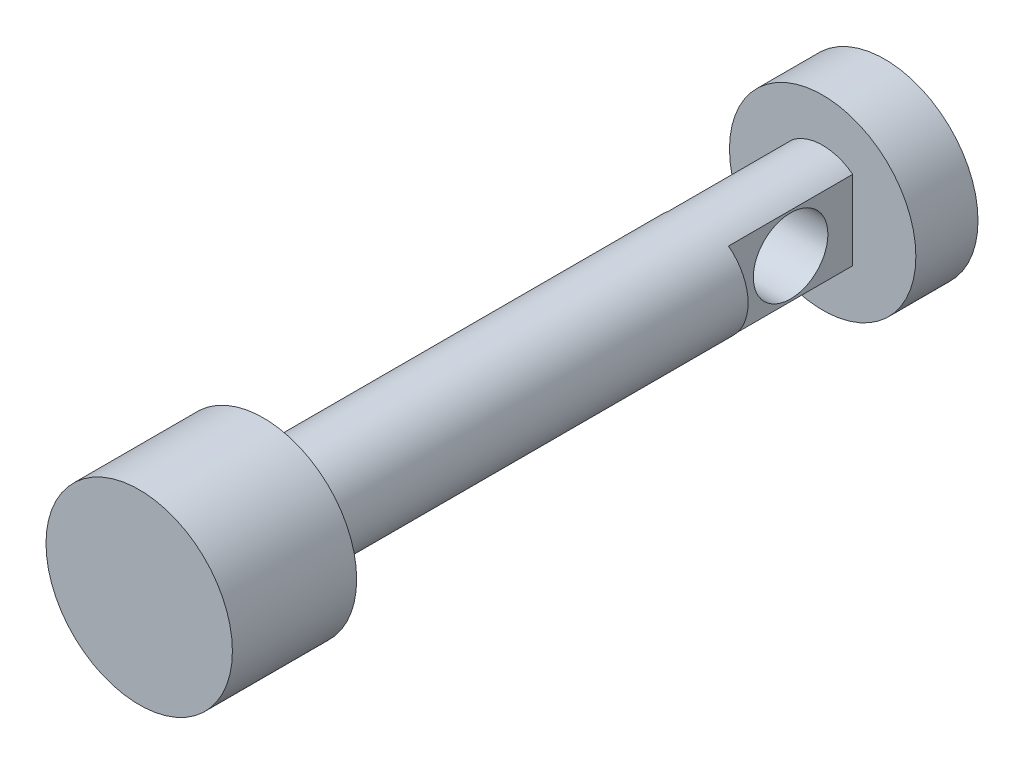
ISO-10303-21;
HEADER;
FILE_DESCRIPTION(('STEP AP214'),'2;1');
FILE_NAME('part.step','',(''),(''),'','','');
FILE_SCHEMA(('AUTOMOTIVE_DESIGN { 1 0 10303 214 1 1 1 1 }'));
ENDSEC;
DATA;
#1=APPLICATION_CONTEXT('core data for automotive mechanical design processes');
#2=APPLICATION_PROTOCOL_DEFINITION('international standard','automotive_design',2000,#1);
#3=PRODUCT_CONTEXT('',#1,'mechanical');
#4=PRODUCT('Part','Part','',(#3));
#5=PRODUCT_RELATED_PRODUCT_CATEGORY('part','',(#4));
#6=PRODUCT_DEFINITION_FORMATION('','',#4);
#7=PRODUCT_DEFINITION_CONTEXT('part definition',#1,'design');
#8=PRODUCT_DEFINITION('design','',#6,#7);
#9=PRODUCT_DEFINITION_SHAPE('','',#8);
#10=(LENGTH_UNIT() NAMED_UNIT(*) SI_UNIT(.MILLI.,.METRE.));
#11=(NAMED_UNIT(*) PLANE_ANGLE_UNIT() SI_UNIT($,.RADIAN.));
#12=(NAMED_UNIT(*) SI_UNIT($,.STERADIAN.) SOLID_ANGLE_UNIT());
#13=UNCERTAINTY_MEASURE_WITH_UNIT(LENGTH_MEASURE(1.E-05),#10,'distance_accuracy_value','');
#14=(GEOMETRIC_REPRESENTATION_CONTEXT(3) GLOBAL_UNCERTAINTY_ASSIGNED_CONTEXT((#13)) GLOBAL_UNIT_ASSIGNED_CONTEXT((#10,
#11,#12)) REPRESENTATION_CONTEXT('',''));
#15=CARTESIAN_POINT('',(0.,0.,0.));
#16=DIRECTION('',(0.,0.,1.));
#17=DIRECTION('',(1.,0.,0.));
#18=AXIS2_PLACEMENT_3D('',#15,#16,#17);
#19=CARTESIAN_POINT('',(0.,0.,60.));
#20=DIRECTION('',(0.,0.,1.));
#21=DIRECTION('',(1.,0.,0.));
#22=AXIS2_PLACEMENT_3D('',#19,#20,#21);
#23=CYLINDRICAL_SURFACE('',#22,8.);
#24=CARTESIAN_POINT('',(0.,0.,40.));
#25=DIRECTION('',(0.,0.,1.));
#26=DIRECTION('',(1.,0.,0.));
#27=AXIS2_PLACEMENT_3D('',#24,#25,#26);
#28=CIRCLE('',#27,8.);
#29=CARTESIAN_POINT('',(8.,0.,40.));
#30=VERTEX_POINT('',#29);
#31=EDGE_CURVE('E107',#30,#30,#28,.T.);
#32=ORIENTED_EDGE('',*,*,#31,.F.);
#33=EDGE_LOOP('',(#32));
#34=FACE_BOUND('',#33,.T.);
#35=DIRECTION('',(0.,0.,-1.));
#36=VECTOR('',#35,1.);
#37=CARTESIAN_POINT('',(-4.83911288800187,-6.3704777259774,-30.));
#38=LINE('',#37,#36);
#39=CARTESIAN_POINT('',(-4.83911288800187,-6.3704777259774,-30.));
#40=VERTEX_POINT('',#39);
#41=CARTESIAN_POINT('',(-4.83911288800187,-6.3704777259774,-50.));
#42=VERTEX_POINT('',#41);
#43=EDGE_CURVE('E78',#40,#42,#38,.T.);
#44=ORIENTED_EDGE('',*,*,#43,.T.);
#45=CARTESIAN_POINT('',(0.,0.,-50.));
#46=DIRECTION('',(0.,0.,-1.));
#47=DIRECTION('',(-1.,0.,0.));
#48=AXIS2_PLACEMENT_3D('',#45,#46,#47);
#49=CIRCLE('',#48,8.);
#50=CARTESIAN_POINT('',(4.83911288800187,-6.3704777259774,-50.));
#51=VERTEX_POINT('',#50);
#52=EDGE_CURVE('E99',#42,#51,#49,.F.);
#53=ORIENTED_EDGE('',*,*,#52,.T.);
#54=DIRECTION('',(0.,0.,-1.));
#55=VECTOR('',#54,1.);
#56=CARTESIAN_POINT('',(4.83911288800187,-6.3704777259774,-30.));
#57=LINE('',#56,#55);
#58=CARTESIAN_POINT('',(4.83911288800187,-6.3704777259774,-30.));
#59=VERTEX_POINT('',#58);
#60=EDGE_CURVE('E122',#59,#51,#57,.T.);
#61=ORIENTED_EDGE('',*,*,#60,.F.);
#62=CARTESIAN_POINT('',(0.,0.,-30.));
#63=DIRECTION('',(0.,0.,-1.));
#64=DIRECTION('',(-1.,0.,0.));
#65=AXIS2_PLACEMENT_3D('',#62,#63,#64);
#66=CIRCLE('',#65,8.);
#67=CARTESIAN_POINT('',(4.83911288800187,6.3704777259774,-30.));
#68=VERTEX_POINT('',#67);
#69=EDGE_CURVE('E196',#68,#59,#66,.T.);
#70=ORIENTED_EDGE('',*,*,#69,.F.);
#71=DIRECTION('',(0.,0.,-1.));
#72=VECTOR('',#71,1.);
#73=CARTESIAN_POINT('',(4.83911288800187,6.3704777259774,-30.));
#74=LINE('',#73,#72);
#75=CARTESIAN_POINT('',(4.83911288800187,6.3704777259774,-50.));
#76=VERTEX_POINT('',#75);
#77=EDGE_CURVE('E102',#68,#76,#74,.T.);
#78=ORIENTED_EDGE('',*,*,#77,.T.);
#79=CARTESIAN_POINT('',(-4.83911288800187,6.3704777259774,-50.));
#80=VERTEX_POINT('',#79);
#81=EDGE_CURVE('E56',#76,#80,#49,.F.);
#82=ORIENTED_EDGE('',*,*,#81,.T.);
#83=DIRECTION('',(0.,0.,-1.));
#84=VECTOR('',#83,1.);
#85=CARTESIAN_POINT('',(-4.83911288800187,6.3704777259774,-30.));
#86=LINE('',#85,#84);
#87=CARTESIAN_POINT('',(-4.83911288800187,6.3704777259774,-30.));
#88=VERTEX_POINT('',#87);
#89=EDGE_CURVE('E89',#88,#80,#86,.T.);
#90=ORIENTED_EDGE('',*,*,#89,.F.);
#91=CARTESIAN_POINT('',(0.,0.,-30.));
#92=DIRECTION('',(0.,0.,-1.));
#93=DIRECTION('',(-1.,0.,0.));
#94=AXIS2_PLACEMENT_3D('',#91,#92,#93);
#95=CIRCLE('',#94,8.);
#96=EDGE_CURVE('E93',#40,#88,#95,.T.);
#97=ORIENTED_EDGE('',*,*,#96,.F.);
#98=EDGE_LOOP('',(#44,#53,#61,#70,#78,#82,#90,#97));
#99=FACE_BOUND('',#98,.T.);
#100=ADVANCED_FACE('F41',(#34,#99),#23,.T.);
#101=CARTESIAN_POINT('',(-4.83911288800187,0.,-30.));
#102=DIRECTION('',(1.,0.,0.));
#103=DIRECTION('',(0.,0.,-1.));
#104=AXIS2_PLACEMENT_3D('',#101,#102,#103);
#105=PLANE('',#104);
#106=CARTESIAN_POINT('',(-4.83911288800187,0.,-40.));
#107=DIRECTION('',(1.,0.,0.));
#108=DIRECTION('',(0.,0.,-1.));
#109=AXIS2_PLACEMENT_3D('',#106,#107,#108);
#110=CIRCLE('',#109,5.99999999999999);
#111=CARTESIAN_POINT('',(-4.83911288800187,0.,-46.));
#112=VERTEX_POINT('',#111);
#113=EDGE_CURVE('E119',#112,#112,#110,.F.);
#114=ORIENTED_EDGE('',*,*,#113,.F.);
#115=EDGE_LOOP('',(#114));
#116=FACE_BOUND('',#115,.T.);
#117=DIRECTION('',(0.,1.,0.));
#118=VECTOR('',#117,1.);
#119=CARTESIAN_POINT('',(-4.83911288800187,0.,-50.));
#120=LINE('',#119,#118);
#121=EDGE_CURVE('E84',#42,#80,#120,.T.);
#122=ORIENTED_EDGE('',*,*,#121,.F.);
#123=ORIENTED_EDGE('',*,*,#43,.F.);
#124=DIRECTION('',(0.,-1.,0.));
#125=VECTOR('',#124,1.);
#126=CARTESIAN_POINT('',(-4.83911288800187,0.,-30.));
#127=LINE('',#126,#125);
#128=EDGE_CURVE('E82',#88,#40,#127,.T.);
#129=ORIENTED_EDGE('',*,*,#128,.F.);
#130=ORIENTED_EDGE('',*,*,#89,.T.);
#131=EDGE_LOOP('',(#122,#123,#129,#130));
#132=FACE_BOUND('',#131,.T.);
#133=ADVANCED_FACE('F80',(#116,#132),#105,.F.);
#134=CARTESIAN_POINT('',(4.83911288800187,0.,-30.));
#135=DIRECTION('',(1.,0.,0.));
#136=DIRECTION('',(0.,0.,-1.));
#137=AXIS2_PLACEMENT_3D('',#134,#135,#136);
#138=PLANE('',#137);
#139=CARTESIAN_POINT('',(4.83911288800187,0.,-40.));
#140=DIRECTION('',(1.,0.,0.));
#141=DIRECTION('',(0.,0.,-1.));
#142=AXIS2_PLACEMENT_3D('',#139,#140,#141);
#143=CIRCLE('',#142,5.99999999999999);
#144=CARTESIAN_POINT('',(4.83911288800187,0.,-46.));
#145=VERTEX_POINT('',#144);
#146=EDGE_CURVE('E112',#145,#145,#143,.F.);
#147=ORIENTED_EDGE('',*,*,#146,.T.);
#148=EDGE_LOOP('',(#147));
#149=FACE_BOUND('',#148,.T.);
#150=ORIENTED_EDGE('',*,*,#60,.T.);
#151=DIRECTION('',(0.,1.,0.));
#152=VECTOR('',#151,1.);
#153=CARTESIAN_POINT('',(4.83911288800187,0.,-50.));
#154=LINE('',#153,#152);
#155=EDGE_CURVE('E11',#51,#76,#154,.T.);
#156=ORIENTED_EDGE('',*,*,#155,.T.);
#157=ORIENTED_EDGE('',*,*,#77,.F.);
#158=DIRECTION('',(0.,-1.,0.));
#159=VECTOR('',#158,1.);
#160=CARTESIAN_POINT('',(4.83911288800187,0.,-30.));
#161=LINE('',#160,#159);
#162=EDGE_CURVE('E64',#68,#59,#161,.T.);
#163=ORIENTED_EDGE('',*,*,#162,.T.);
#164=EDGE_LOOP('',(#150,#156,#157,#163));
#165=FACE_BOUND('',#164,.T.);
#166=ADVANCED_FACE('F127',(#149,#165),#138,.T.);
#167=CARTESIAN_POINT('',(0.,0.,60.));
#168=DIRECTION('',(0.,0.,1.));
#169=DIRECTION('',(1.,0.,0.));
#170=AXIS2_PLACEMENT_3D('',#167,#168,#169);
#171=PLANE('',#170);
#172=CARTESIAN_POINT('',(0.,0.,60.));
#173=DIRECTION('',(0.,0.,1.));
#174=DIRECTION('',(1.,0.,0.));
#175=AXIS2_PLACEMENT_3D('',#172,#173,#174);
#176=CIRCLE('',#175,15.);
#177=CARTESIAN_POINT('',(15.,0.,60.));
#178=VERTEX_POINT('',#177);
#179=EDGE_CURVE('E49',#178,#178,#176,.T.);
#180=ORIENTED_EDGE('',*,*,#179,.T.);
#181=EDGE_LOOP('',(#180));
#182=FACE_BOUND('',#181,.T.);
#183=ADVANCED_FACE('F163',(#182),#171,.T.);
#184=CARTESIAN_POINT('',(0.,0.,60.));
#185=DIRECTION('',(0.,0.,1.));
#186=DIRECTION('',(1.,0.,0.));
#187=AXIS2_PLACEMENT_3D('',#184,#185,#186);
#188=CYLINDRICAL_SURFACE('',#187,15.);
#189=CARTESIAN_POINT('',(0.,0.,40.));
#190=DIRECTION('',(0.,0.,1.));
#191=DIRECTION('',(1.,0.,0.));
#192=AXIS2_PLACEMENT_3D('',#189,#190,#191);
#193=CIRCLE('',#192,15.);
#194=CARTESIAN_POINT('',(15.,0.,40.));
#195=VERTEX_POINT('',#194);
#196=EDGE_CURVE('E111',#195,#195,#193,.T.);
#197=ORIENTED_EDGE('',*,*,#196,.T.);
#198=EDGE_LOOP('',(#197));
#199=FACE_BOUND('',#198,.T.);
#200=ORIENTED_EDGE('',*,*,#179,.F.);
#201=EDGE_LOOP('',(#200));
#202=FACE_BOUND('',#201,.T.);
#203=ADVANCED_FACE('F158',(#199,#202),#188,.T.);
#204=CARTESIAN_POINT('',(0.,15.,40.));
#205=DIRECTION('',(0.,0.,-1.));
#206=DIRECTION('',(-1.,0.,0.));
#207=AXIS2_PLACEMENT_3D('',#204,#205,#206);
#208=PLANE('',#207);
#209=ORIENTED_EDGE('',*,*,#31,.T.);
#210=EDGE_LOOP('',(#209));
#211=FACE_BOUND('',#210,.T.);
#212=ORIENTED_EDGE('',*,*,#196,.F.);
#213=EDGE_LOOP('',(#212));
#214=FACE_BOUND('',#213,.T.);
#215=ADVANCED_FACE('F155',(#211,#214),#208,.T.);
#216=CARTESIAN_POINT('',(0.,0.,-30.));
#217=DIRECTION('',(0.,0.,-1.));
#218=DIRECTION('',(-1.,0.,0.));
#219=AXIS2_PLACEMENT_3D('',#216,#217,#218);
#220=PLANE('',#219);
#221=ORIENTED_EDGE('',*,*,#96,.T.);
#222=ORIENTED_EDGE('',*,*,#128,.T.);
#223=EDGE_LOOP('',(#221,#222));
#224=FACE_BOUND('',#223,.T.);
#225=ADVANCED_FACE('F92',(#224),#220,.T.);
#226=CARTESIAN_POINT('',(0.,0.,-30.));
#227=DIRECTION('',(0.,0.,-1.));
#228=DIRECTION('',(-1.,0.,0.));
#229=AXIS2_PLACEMENT_3D('',#226,#227,#228);
#230=PLANE('',#229);
#231=ORIENTED_EDGE('',*,*,#162,.F.);
#232=ORIENTED_EDGE('',*,*,#69,.T.);
#233=EDGE_LOOP('',(#231,#232));
#234=FACE_BOUND('',#233,.T.);
#235=ADVANCED_FACE('F132',(#234),#230,.T.);
#236=CARTESIAN_POINT('',(-15.,0.,-40.));
#237=DIRECTION('',(1.,0.,0.));
#238=DIRECTION('',(0.,0.,-1.));
#239=AXIS2_PLACEMENT_3D('',#236,#237,#238);
#240=CYLINDRICAL_SURFACE('',#239,5.99999999999999);
#241=ORIENTED_EDGE('',*,*,#113,.T.);
#242=EDGE_LOOP('',(#241));
#243=FACE_BOUND('',#242,.T.);
#244=ORIENTED_EDGE('',*,*,#146,.F.);
#245=EDGE_LOOP('',(#244));
#246=FACE_BOUND('',#245,.T.);
#247=ADVANCED_FACE('F129',(#243,#246),#240,.F.);
#248=CARTESIAN_POINT('',(0.,0.,-50.));
#249=DIRECTION('',(0.,0.,-1.));
#250=DIRECTION('',(-1.,0.,0.));
#251=AXIS2_PLACEMENT_3D('',#248,#249,#250);
#252=PLANE('',#251);
#253=CARTESIAN_POINT('',(0.,0.,-50.));
#254=DIRECTION('',(0.,0.,-1.));
#255=DIRECTION('',(-1.,0.,0.));
#256=AXIS2_PLACEMENT_3D('',#253,#254,#255);
#257=CIRCLE('',#256,15.);
#258=CARTESIAN_POINT('',(-15.,0.,-50.));
#259=VERTEX_POINT('',#258);
#260=EDGE_CURVE('E186',#259,#259,#257,.T.);
#261=ORIENTED_EDGE('',*,*,#260,.F.);
#262=EDGE_LOOP('',(#261));
#263=FACE_BOUND('',#262,.T.);
#264=ORIENTED_EDGE('',*,*,#52,.F.);
#265=ORIENTED_EDGE('',*,*,#121,.T.);
#266=ORIENTED_EDGE('',*,*,#81,.F.);
#267=ORIENTED_EDGE('',*,*,#155,.F.);
#268=EDGE_LOOP('',(#264,#265,#266,#267));
#269=FACE_BOUND('',#268,.T.);
#270=ADVANCED_FACE('F131',(#263,#269),#252,.F.);
#271=CARTESIAN_POINT('',(0.,0.,-50.));
#272=DIRECTION('',(0.,0.,-1.));
#273=DIRECTION('',(-1.,0.,0.));
#274=AXIS2_PLACEMENT_3D('',#271,#272,#273);
#275=CYLINDRICAL_SURFACE('',#274,15.);
#276=ORIENTED_EDGE('',*,*,#260,.T.);
#277=EDGE_LOOP('',(#276));
#278=FACE_BOUND('',#277,.T.);
#279=CARTESIAN_POINT('',(0.,0.,-60.));
#280=DIRECTION('',(0.,0.,-1.));
#281=DIRECTION('',(-1.,0.,0.));
#282=AXIS2_PLACEMENT_3D('',#279,#280,#281);
#283=CIRCLE('',#282,15.);
#284=CARTESIAN_POINT('',(-15.,0.,-60.));
#285=VERTEX_POINT('',#284);
#286=EDGE_CURVE('E183',#285,#285,#283,.T.);
#287=ORIENTED_EDGE('',*,*,#286,.F.);
#288=EDGE_LOOP('',(#287));
#289=FACE_BOUND('',#288,.T.);
#290=ADVANCED_FACE('F140',(#278,#289),#275,.T.);
#291=CARTESIAN_POINT('',(0.,8.,-60.));
#292=DIRECTION('',(0.,0.,-1.));
#293=DIRECTION('',(-1.,0.,0.));
#294=AXIS2_PLACEMENT_3D('',#291,#292,#293);
#295=PLANE('',#294);
#296=ORIENTED_EDGE('',*,*,#286,.T.);
#297=EDGE_LOOP('',(#296));
#298=FACE_BOUND('',#297,.T.);
#299=ADVANCED_FACE('F173',(#298),#295,.T.);
#300=CLOSED_SHELL('',(#100,#133,#166,#183,#203,#215,#225,#235,#247,#270,#290,#299));
#301=MANIFOLD_SOLID_BREP('B2',#300);
#302=ADVANCED_BREP_SHAPE_REPRESENTATION('',(#18,#301),#14);
#303=SHAPE_DEFINITION_REPRESENTATION(#9,#302);
ENDSEC;
END-ISO-10303-21;
